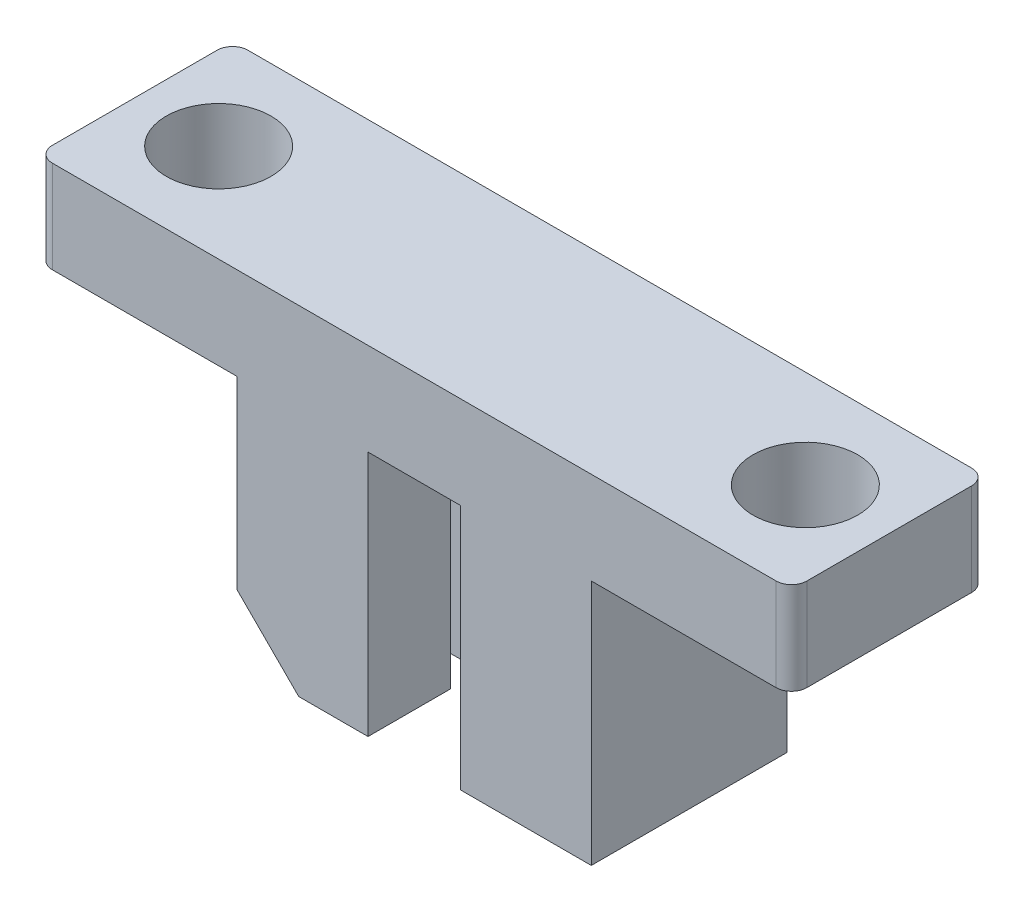
ISO-10303-21;
HEADER;
FILE_DESCRIPTION(('STEP AP214'),'2;1');
FILE_NAME('part.step','',(''),(''),'','','');
FILE_SCHEMA(('AUTOMOTIVE_DESIGN { 1 0 10303 214 1 1 1 1 }'));
ENDSEC;
DATA;
#1=APPLICATION_CONTEXT('core data for automotive mechanical design processes');
#2=APPLICATION_PROTOCOL_DEFINITION('international standard','automotive_design',2000,#1);
#3=PRODUCT_CONTEXT('',#1,'mechanical');
#4=PRODUCT('Part','Part','',(#3));
#5=PRODUCT_RELATED_PRODUCT_CATEGORY('part','',(#4));
#6=PRODUCT_DEFINITION_FORMATION('','',#4);
#7=PRODUCT_DEFINITION_CONTEXT('part definition',#1,'design');
#8=PRODUCT_DEFINITION('design','',#6,#7);
#9=PRODUCT_DEFINITION_SHAPE('','',#8);
#10=(LENGTH_UNIT() NAMED_UNIT(*) SI_UNIT(.MILLI.,.METRE.));
#11=(NAMED_UNIT(*) PLANE_ANGLE_UNIT() SI_UNIT($,.RADIAN.));
#12=(NAMED_UNIT(*) SI_UNIT($,.STERADIAN.) SOLID_ANGLE_UNIT());
#13=UNCERTAINTY_MEASURE_WITH_UNIT(LENGTH_MEASURE(1.E-05),#10,'distance_accuracy_value','');
#14=(GEOMETRIC_REPRESENTATION_CONTEXT(3) GLOBAL_UNCERTAINTY_ASSIGNED_CONTEXT((#13)) GLOBAL_UNIT_ASSIGNED_CONTEXT((#10,
#11,#12)) REPRESENTATION_CONTEXT('',''));
#15=CARTESIAN_POINT('',(0.,0.,0.));
#16=DIRECTION('',(0.,0.,1.));
#17=DIRECTION('',(1.,0.,0.));
#18=AXIS2_PLACEMENT_3D('',#15,#16,#17);
#19=CARTESIAN_POINT('',(-12.25,-3.,3.175));
#20=DIRECTION('',(1.,0.,0.));
#21=DIRECTION('',(0.,0.707106781186548,0.707106781186548));
#22=AXIS2_PLACEMENT_3D('',#19,#20,#21);
#23=PLANE('',#22);
#24=DIRECTION('',(0.,0.,-1.));
#25=VECTOR('',#24,1.);
#26=CARTESIAN_POINT('',(-12.25,-3.,2.675));
#27=LINE('',#26,#25);
#28=CARTESIAN_POINT('',(-12.25,-3.,2.675));
#29=VERTEX_POINT('',#28);
#30=CARTESIAN_POINT('',(-12.25,-3.,-2.675));
#31=VERTEX_POINT('',#30);
#32=EDGE_CURVE('E35',#29,#31,#27,.T.);
#33=ORIENTED_EDGE('',*,*,#32,.F.);
#34=DIRECTION('',(0.,1.,0.));
#35=VECTOR('',#34,1.);
#36=CARTESIAN_POINT('',(-12.25,0.,2.675));
#37=LINE('',#36,#35);
#38=CARTESIAN_POINT('',(-12.25,0.,2.675));
#39=VERTEX_POINT('',#38);
#40=EDGE_CURVE('E11',#29,#39,#37,.T.);
#41=ORIENTED_EDGE('',*,*,#40,.T.);
#42=DIRECTION('',(0.,0.,-1.));
#43=VECTOR('',#42,1.);
#44=CARTESIAN_POINT('',(-12.25,0.,2.675));
#45=LINE('',#44,#43);
#46=CARTESIAN_POINT('',(-12.25,0.,-2.675));
#47=VERTEX_POINT('',#46);
#48=EDGE_CURVE('E27',#39,#47,#45,.T.);
#49=ORIENTED_EDGE('',*,*,#48,.T.);
#50=DIRECTION('',(0.,-1.,0.));
#51=VECTOR('',#50,1.);
#52=CARTESIAN_POINT('',(-12.25,0.,-2.675));
#53=LINE('',#52,#51);
#54=EDGE_CURVE('E410',#47,#31,#53,.T.);
#55=ORIENTED_EDGE('',*,*,#54,.T.);
#56=EDGE_LOOP('',(#33,#41,#49,#55));
#57=FACE_BOUND('',#56,.T.);
#58=ADVANCED_FACE('F17',(#57),#23,.F.);
#59=CARTESIAN_POINT('',(-5.75,-3.,3.175));
#60=DIRECTION('',(0.,1.,0.));
#61=DIRECTION('',(0.707106781186548,0.,0.707106781186548));
#62=AXIS2_PLACEMENT_3D('',#59,#60,#61);
#63=PLANE('',#62);
#64=DIRECTION('',(1.,0.,0.));
#65=VECTOR('',#64,1.);
#66=CARTESIAN_POINT('',(-11.75,-3.,3.175));
#67=LINE('',#66,#65);
#68=CARTESIAN_POINT('',(-11.75,-3.,3.175));
#69=VERTEX_POINT('',#68);
#70=CARTESIAN_POINT('',(-5.75,-3.,3.175));
#71=VERTEX_POINT('',#70);
#72=EDGE_CURVE('E346',#69,#71,#67,.T.);
#73=ORIENTED_EDGE('',*,*,#72,.F.);
#74=CARTESIAN_POINT('',(-11.75,-3.,2.675));
#75=DIRECTION('',(0.,-1.,0.));
#76=DIRECTION('',(-1.,0.,0.));
#77=AXIS2_PLACEMENT_3D('',#74,#75,#76);
#78=CIRCLE('',#77,0.5);
#79=EDGE_CURVE('E407',#69,#29,#78,.T.);
#80=ORIENTED_EDGE('',*,*,#79,.T.);
#81=ORIENTED_EDGE('',*,*,#32,.T.);
#82=CARTESIAN_POINT('',(-11.75,-3.,-2.675));
#83=DIRECTION('',(0.,-1.,0.));
#84=DIRECTION('',(-1.,0.,0.));
#85=AXIS2_PLACEMENT_3D('',#82,#83,#84);
#86=CIRCLE('',#85,0.5);
#87=CARTESIAN_POINT('',(-11.75,-3.,-3.175));
#88=VERTEX_POINT('',#87);
#89=EDGE_CURVE('E404',#31,#88,#86,.T.);
#90=ORIENTED_EDGE('',*,*,#89,.T.);
#91=DIRECTION('',(1.,0.,0.));
#92=VECTOR('',#91,1.);
#93=CARTESIAN_POINT('',(-11.75,-3.,-3.175));
#94=LINE('',#93,#92);
#95=CARTESIAN_POINT('',(-5.75,-3.,-3.175));
#96=VERTEX_POINT('',#95);
#97=EDGE_CURVE('E398',#88,#96,#94,.T.);
#98=ORIENTED_EDGE('',*,*,#97,.T.);
#99=DIRECTION('',(0.,0.,-1.));
#100=VECTOR('',#99,1.);
#101=CARTESIAN_POINT('',(-5.75,-3.,3.175));
#102=LINE('',#101,#100);
#103=EDGE_CURVE('E392',#71,#96,#102,.T.);
#104=ORIENTED_EDGE('',*,*,#103,.F.);
#105=EDGE_LOOP('',(#73,#80,#81,#90,#98,#104));
#106=FACE_BOUND('',#105,.T.);
#107=CARTESIAN_POINT('',(-9.525,-3.,0.));
#108=DIRECTION('',(0.,-1.,0.));
#109=DIRECTION('',(0.,0.,-1.));
#110=AXIS2_PLACEMENT_3D('',#107,#108,#109);
#111=CIRCLE('',#110,1.7);
#112=CARTESIAN_POINT('',(-9.525,-3.,-1.7));
#113=VERTEX_POINT('',#112);
#114=EDGE_CURVE('E313',#113,#113,#111,.T.);
#115=ORIENTED_EDGE('',*,*,#114,.F.);
#116=EDGE_LOOP('',(#115));
#117=FACE_BOUND('',#116,.T.);
#118=ADVANCED_FACE('F416',(#106,#117),#63,.F.);
#119=CARTESIAN_POINT('',(-5.75,-9.,3.175));
#120=DIRECTION('',(1.,0.,0.));
#121=DIRECTION('',(0.,0.707106781186548,0.707106781186548));
#122=AXIS2_PLACEMENT_3D('',#119,#120,#121);
#123=PLANE('',#122);
#124=DIRECTION('',(0.,-1.,0.));
#125=VECTOR('',#124,1.);
#126=CARTESIAN_POINT('',(-5.75,-3.,-3.175));
#127=LINE('',#126,#125);
#128=CARTESIAN_POINT('',(-5.75,-9.,-3.175));
#129=VERTEX_POINT('',#128);
#130=EDGE_CURVE('E395',#96,#129,#127,.T.);
#131=ORIENTED_EDGE('',*,*,#130,.T.);
#132=DIRECTION('',(0.,0.,-1.));
#133=VECTOR('',#132,1.);
#134=CARTESIAN_POINT('',(-5.75,-9.,3.175));
#135=LINE('',#134,#133);
#136=CARTESIAN_POINT('',(-5.75,-9.,3.175));
#137=VERTEX_POINT('',#136);
#138=EDGE_CURVE('E389',#137,#129,#135,.T.);
#139=ORIENTED_EDGE('',*,*,#138,.F.);
#140=DIRECTION('',(0.,-1.,0.));
#141=VECTOR('',#140,1.);
#142=CARTESIAN_POINT('',(-5.75,-3.,3.175));
#143=LINE('',#142,#141);
#144=EDGE_CURVE('E382',#71,#137,#143,.T.);
#145=ORIENTED_EDGE('',*,*,#144,.F.);
#146=ORIENTED_EDGE('',*,*,#103,.T.);
#147=EDGE_LOOP('',(#131,#139,#145,#146));
#148=FACE_BOUND('',#147,.T.);
#149=ADVANCED_FACE('F430',(#148),#123,.F.);
#150=CARTESIAN_POINT('',(-3.75,-11.,3.175));
#151=DIRECTION('',(0.707106781186548,0.707106781186548,0.));
#152=DIRECTION('',(-0.577350269189626,0.577350269189626,0.577350269189626));
#153=AXIS2_PLACEMENT_3D('',#150,#151,#152);
#154=PLANE('',#153);
#155=DIRECTION('',(0.707106781186548,-0.707106781186548,0.));
#156=VECTOR('',#155,1.);
#157=CARTESIAN_POINT('',(-5.75,-9.,-3.175));
#158=LINE('',#157,#156);
#159=CARTESIAN_POINT('',(-3.75,-11.,-3.175));
#160=VERTEX_POINT('',#159);
#161=EDGE_CURVE('E390',#129,#160,#158,.T.);
#162=ORIENTED_EDGE('',*,*,#161,.T.);
#163=DIRECTION('',(0.,0.,-1.));
#164=VECTOR('',#163,1.);
#165=CARTESIAN_POINT('',(-3.75,-11.,3.175));
#166=LINE('',#165,#164);
#167=CARTESIAN_POINT('',(-3.75,-11.,3.175));
#168=VERTEX_POINT('',#167);
#169=EDGE_CURVE('E378',#168,#160,#166,.T.);
#170=ORIENTED_EDGE('',*,*,#169,.F.);
#171=DIRECTION('',(0.707106781186548,-0.707106781186548,0.));
#172=VECTOR('',#171,1.);
#173=CARTESIAN_POINT('',(-5.75,-9.,3.175));
#174=LINE('',#173,#172);
#175=EDGE_CURVE('E380',#137,#168,#174,.T.);
#176=ORIENTED_EDGE('',*,*,#175,.F.);
#177=ORIENTED_EDGE('',*,*,#138,.T.);
#178=EDGE_LOOP('',(#162,#170,#176,#177));
#179=FACE_BOUND('',#178,.T.);
#180=ADVANCED_FACE('F474',(#179),#154,.F.);
#181=CARTESIAN_POINT('',(-1.5,-11.,3.175));
#182=DIRECTION('',(0.,1.,0.));
#183=DIRECTION('',(0.707106781186548,0.,0.707106781186548));
#184=AXIS2_PLACEMENT_3D('',#181,#182,#183);
#185=PLANE('',#184);
#186=DIRECTION('',(0.,0.,-1.));
#187=VECTOR('',#186,1.);
#188=CARTESIAN_POINT('',(-2.675,-11.,0.5));
#189=LINE('',#188,#187);
#190=CARTESIAN_POINT('',(-2.675,-11.,0.5));
#191=VERTEX_POINT('',#190);
#192=CARTESIAN_POINT('',(-2.675,-11.,-0.5));
#193=VERTEX_POINT('',#192);
#194=EDGE_CURVE('E214',#191,#193,#189,.T.);
#195=ORIENTED_EDGE('',*,*,#194,.F.);
#196=DIRECTION('',(-1.,0.,0.));
#197=VECTOR('',#196,1.);
#198=CARTESIAN_POINT('',(-1.5,-11.,0.5));
#199=LINE('',#198,#197);
#200=CARTESIAN_POINT('',(-1.5,-11.,0.5));
#201=VERTEX_POINT('',#200);
#202=EDGE_CURVE('E206',#201,#191,#199,.T.);
#203=ORIENTED_EDGE('',*,*,#202,.F.);
#204=DIRECTION('',(0.,0.,-1.));
#205=VECTOR('',#204,1.);
#206=CARTESIAN_POINT('',(-1.5,-11.,3.175));
#207=LINE('',#206,#205);
#208=CARTESIAN_POINT('',(-1.5,-11.,3.175));
#209=VERTEX_POINT('',#208);
#210=EDGE_CURVE('E230',#209,#201,#207,.T.);
#211=ORIENTED_EDGE('',*,*,#210,.F.);
#212=DIRECTION('',(1.,0.,0.));
#213=VECTOR('',#212,1.);
#214=CARTESIAN_POINT('',(-3.75,-11.,3.175));
#215=LINE('',#214,#213);
#216=EDGE_CURVE('E244',#168,#209,#215,.T.);
#217=ORIENTED_EDGE('',*,*,#216,.F.);
#218=ORIENTED_EDGE('',*,*,#169,.T.);
#219=DIRECTION('',(1.,0.,0.));
#220=VECTOR('',#219,1.);
#221=CARTESIAN_POINT('',(-3.75,-11.,-3.175));
#222=LINE('',#221,#220);
#223=CARTESIAN_POINT('',(-1.5,-11.,-3.175));
#224=VERTEX_POINT('',#223);
#225=EDGE_CURVE('E375',#160,#224,#222,.T.);
#226=ORIENTED_EDGE('',*,*,#225,.T.);
#227=DIRECTION('',(0.,0.,-1.));
#228=VECTOR('',#227,1.);
#229=CARTESIAN_POINT('',(-1.5,-11.,-0.5));
#230=LINE('',#229,#228);
#231=CARTESIAN_POINT('',(-1.5,-11.,-0.5));
#232=VERTEX_POINT('',#231);
#233=EDGE_CURVE('E225',#232,#224,#230,.T.);
#234=ORIENTED_EDGE('',*,*,#233,.F.);
#235=DIRECTION('',(1.,0.,0.));
#236=VECTOR('',#235,1.);
#237=CARTESIAN_POINT('',(-2.675,-11.,-0.5));
#238=LINE('',#237,#236);
#239=EDGE_CURVE('E216',#193,#232,#238,.T.);
#240=ORIENTED_EDGE('',*,*,#239,.F.);
#241=EDGE_LOOP('',(#195,#203,#211,#217,#218,#226,#234,#240));
#242=FACE_BOUND('',#241,.T.);
#243=ADVANCED_FACE('F369',(#242),#185,.F.);
#244=CARTESIAN_POINT('',(-1.5,-3.,3.175));
#245=DIRECTION('',(-1.,0.,0.));
#246=DIRECTION('',(0.,0.707106781186548,0.707106781186548));
#247=AXIS2_PLACEMENT_3D('',#244,#245,#246);
#248=PLANE('',#247);
#249=ORIENTED_EDGE('',*,*,#210,.T.);
#250=DIRECTION('',(0.,1.,0.));
#251=VECTOR('',#250,1.);
#252=CARTESIAN_POINT('',(-1.5,-11.,0.5));
#253=LINE('',#252,#251);
#254=CARTESIAN_POINT('',(-1.5,-5.5,0.5));
#255=VERTEX_POINT('',#254);
#256=EDGE_CURVE('E227',#201,#255,#253,.T.);
#257=ORIENTED_EDGE('',*,*,#256,.T.);
#258=DIRECTION('',(0.,0.,1.));
#259=VECTOR('',#258,1.);
#260=CARTESIAN_POINT('',(-1.5,-5.5,-0.5));
#261=LINE('',#260,#259);
#262=CARTESIAN_POINT('',(-1.5,-5.5,-0.5));
#263=VERTEX_POINT('',#262);
#264=EDGE_CURVE('E231',#263,#255,#261,.T.);
#265=ORIENTED_EDGE('',*,*,#264,.F.);
#266=DIRECTION('',(0.,-1.,0.));
#267=VECTOR('',#266,1.);
#268=CARTESIAN_POINT('',(-1.5,-5.5,-0.5));
#269=LINE('',#268,#267);
#270=EDGE_CURVE('E204',#263,#232,#269,.T.);
#271=ORIENTED_EDGE('',*,*,#270,.T.);
#272=ORIENTED_EDGE('',*,*,#233,.T.);
#273=DIRECTION('',(0.,1.,0.));
#274=VECTOR('',#273,1.);
#275=CARTESIAN_POINT('',(-1.5,-11.,-3.175));
#276=LINE('',#275,#274);
#277=CARTESIAN_POINT('',(-1.5,-3.,-3.175));
#278=VERTEX_POINT('',#277);
#279=EDGE_CURVE('E235',#224,#278,#276,.T.);
#280=ORIENTED_EDGE('',*,*,#279,.T.);
#281=DIRECTION('',(0.,0.,-1.));
#282=VECTOR('',#281,1.);
#283=CARTESIAN_POINT('',(-1.5,-3.,3.175));
#284=LINE('',#283,#282);
#285=CARTESIAN_POINT('',(-1.5,-3.,3.175));
#286=VERTEX_POINT('',#285);
#287=EDGE_CURVE('E239',#286,#278,#284,.T.);
#288=ORIENTED_EDGE('',*,*,#287,.F.);
#289=DIRECTION('',(0.,1.,0.));
#290=VECTOR('',#289,1.);
#291=CARTESIAN_POINT('',(-1.5,-11.,3.175));
#292=LINE('',#291,#290);
#293=EDGE_CURVE('E242',#209,#286,#292,.T.);
#294=ORIENTED_EDGE('',*,*,#293,.F.);
#295=EDGE_LOOP('',(#249,#257,#265,#271,#272,#280,#288,#294));
#296=FACE_BOUND('',#295,.T.);
#297=ADVANCED_FACE('F373',(#296),#248,.F.);
#298=CARTESIAN_POINT('',(1.5,-3.,3.175));
#299=DIRECTION('',(0.,1.,0.));
#300=DIRECTION('',(0.707106781186548,0.,0.707106781186548));
#301=AXIS2_PLACEMENT_3D('',#298,#299,#300);
#302=PLANE('',#301);
#303=DIRECTION('',(1.,0.,0.));
#304=VECTOR('',#303,1.);
#305=CARTESIAN_POINT('',(-1.5,-3.,-3.175));
#306=LINE('',#305,#304);
#307=CARTESIAN_POINT('',(1.5,-3.,-3.175));
#308=VERTEX_POINT('',#307);
#309=EDGE_CURVE('E238',#278,#308,#306,.T.);
#310=ORIENTED_EDGE('',*,*,#309,.T.);
#311=DIRECTION('',(0.,0.,-1.));
#312=VECTOR('',#311,1.);
#313=CARTESIAN_POINT('',(1.5,-3.,3.175));
#314=LINE('',#313,#312);
#315=CARTESIAN_POINT('',(1.5,-3.,3.175));
#316=VERTEX_POINT('',#315);
#317=EDGE_CURVE('E248',#316,#308,#314,.T.);
#318=ORIENTED_EDGE('',*,*,#317,.F.);
#319=DIRECTION('',(1.,0.,0.));
#320=VECTOR('',#319,1.);
#321=CARTESIAN_POINT('',(-1.5,-3.,3.175));
#322=LINE('',#321,#320);
#323=EDGE_CURVE('E245',#286,#316,#322,.T.);
#324=ORIENTED_EDGE('',*,*,#323,.F.);
#325=ORIENTED_EDGE('',*,*,#287,.T.);
#326=EDGE_LOOP('',(#310,#318,#324,#325));
#327=FACE_BOUND('',#326,.T.);
#328=ADVANCED_FACE('F471',(#327),#302,.F.);
#329=CARTESIAN_POINT('',(1.5,-11.,3.175));
#330=DIRECTION('',(1.,0.,0.));
#331=DIRECTION('',(0.,0.707106781186548,0.707106781186548));
#332=AXIS2_PLACEMENT_3D('',#329,#330,#331);
#333=PLANE('',#332);
#334=DIRECTION('',(0.,0.,-1.));
#335=VECTOR('',#334,1.);
#336=CARTESIAN_POINT('',(1.5,-5.5,0.5));
#337=LINE('',#336,#335);
#338=CARTESIAN_POINT('',(1.5,-5.5,0.5));
#339=VERTEX_POINT('',#338);
#340=CARTESIAN_POINT('',(1.5,-5.5,-0.5));
#341=VERTEX_POINT('',#340);
#342=EDGE_CURVE('E253',#339,#341,#337,.T.);
#343=ORIENTED_EDGE('',*,*,#342,.F.);
#344=DIRECTION('',(0.,-1.,0.));
#345=VECTOR('',#344,1.);
#346=CARTESIAN_POINT('',(1.5,-5.5,0.5));
#347=LINE('',#346,#345);
#348=CARTESIAN_POINT('',(1.5,-11.,0.5));
#349=VERTEX_POINT('',#348);
#350=EDGE_CURVE('E241',#339,#349,#347,.T.);
#351=ORIENTED_EDGE('',*,*,#350,.T.);
#352=DIRECTION('',(0.,0.,-1.));
#353=VECTOR('',#352,1.);
#354=CARTESIAN_POINT('',(1.5,-11.,3.175));
#355=LINE('',#354,#353);
#356=CARTESIAN_POINT('',(1.5,-11.,3.175));
#357=VERTEX_POINT('',#356);
#358=EDGE_CURVE('E259',#357,#349,#355,.T.);
#359=ORIENTED_EDGE('',*,*,#358,.F.);
#360=DIRECTION('',(0.,-1.,0.));
#361=VECTOR('',#360,1.);
#362=CARTESIAN_POINT('',(1.5,-3.,3.175));
#363=LINE('',#362,#361);
#364=EDGE_CURVE('E252',#316,#357,#363,.T.);
#365=ORIENTED_EDGE('',*,*,#364,.F.);
#366=ORIENTED_EDGE('',*,*,#317,.T.);
#367=DIRECTION('',(0.,-1.,0.));
#368=VECTOR('',#367,1.);
#369=CARTESIAN_POINT('',(1.5,-3.,-3.175));
#370=LINE('',#369,#368);
#371=CARTESIAN_POINT('',(1.5,-11.,-3.175));
#372=VERTEX_POINT('',#371);
#373=EDGE_CURVE('E250',#308,#372,#370,.T.);
#374=ORIENTED_EDGE('',*,*,#373,.T.);
#375=DIRECTION('',(0.,0.,-1.));
#376=VECTOR('',#375,1.);
#377=CARTESIAN_POINT('',(1.5,-11.,-0.5));
#378=LINE('',#377,#376);
#379=CARTESIAN_POINT('',(1.5,-11.,-0.5));
#380=VERTEX_POINT('',#379);
#381=EDGE_CURVE('E267',#380,#372,#378,.T.);
#382=ORIENTED_EDGE('',*,*,#381,.F.);
#383=DIRECTION('',(0.,1.,0.));
#384=VECTOR('',#383,1.);
#385=CARTESIAN_POINT('',(1.5,-11.,-0.5));
#386=LINE('',#385,#384);
#387=EDGE_CURVE('E261',#380,#341,#386,.T.);
#388=ORIENTED_EDGE('',*,*,#387,.T.);
#389=EDGE_LOOP('',(#343,#351,#359,#365,#366,#374,#382,#388));
#390=FACE_BOUND('',#389,.T.);
#391=ADVANCED_FACE('F464',(#390),#333,.F.);
#392=CARTESIAN_POINT('',(5.75,-11.,3.175));
#393=DIRECTION('',(0.,1.,0.));
#394=DIRECTION('',(0.707106781186548,0.,0.707106781186548));
#395=AXIS2_PLACEMENT_3D('',#392,#393,#394);
#396=PLANE('',#395);
#397=ORIENTED_EDGE('',*,*,#358,.T.);
#398=DIRECTION('',(-1.,0.,0.));
#399=VECTOR('',#398,1.);
#400=CARTESIAN_POINT('',(2.675,-11.,0.5));
#401=LINE('',#400,#399);
#402=CARTESIAN_POINT('',(2.675,-11.,0.5));
#403=VERTEX_POINT('',#402);
#404=EDGE_CURVE('E255',#403,#349,#401,.T.);
#405=ORIENTED_EDGE('',*,*,#404,.F.);
#406=DIRECTION('',(0.,0.,1.));
#407=VECTOR('',#406,1.);
#408=CARTESIAN_POINT('',(2.675,-11.,-0.5));
#409=LINE('',#408,#407);
#410=CARTESIAN_POINT('',(2.675,-11.,-0.5));
#411=VERTEX_POINT('',#410);
#412=EDGE_CURVE('E275',#411,#403,#409,.T.);
#413=ORIENTED_EDGE('',*,*,#412,.F.);
#414=DIRECTION('',(-1.,0.,0.));
#415=VECTOR('',#414,1.);
#416=CARTESIAN_POINT('',(2.675,-11.,-0.5));
#417=LINE('',#416,#415);
#418=EDGE_CURVE('E262',#411,#380,#417,.T.);
#419=ORIENTED_EDGE('',*,*,#418,.T.);
#420=ORIENTED_EDGE('',*,*,#381,.T.);
#421=DIRECTION('',(1.,0.,0.));
#422=VECTOR('',#421,1.);
#423=CARTESIAN_POINT('',(1.5,-11.,-3.175));
#424=LINE('',#423,#422);
#425=CARTESIAN_POINT('',(5.75,-11.,-3.175));
#426=VERTEX_POINT('',#425);
#427=EDGE_CURVE('E269',#372,#426,#424,.T.);
#428=ORIENTED_EDGE('',*,*,#427,.T.);
#429=DIRECTION('',(0.,0.,-1.));
#430=VECTOR('',#429,1.);
#431=CARTESIAN_POINT('',(5.75,-11.,3.175));
#432=LINE('',#431,#430);
#433=CARTESIAN_POINT('',(5.75,-11.,3.175));
#434=VERTEX_POINT('',#433);
#435=EDGE_CURVE('E285',#434,#426,#432,.T.);
#436=ORIENTED_EDGE('',*,*,#435,.F.);
#437=DIRECTION('',(1.,0.,0.));
#438=VECTOR('',#437,1.);
#439=CARTESIAN_POINT('',(1.5,-11.,3.175));
#440=LINE('',#439,#438);
#441=EDGE_CURVE('E264',#357,#434,#440,.T.);
#442=ORIENTED_EDGE('',*,*,#441,.F.);
#443=EDGE_LOOP('',(#397,#405,#413,#419,#420,#428,#436,#442));
#444=FACE_BOUND('',#443,.T.);
#445=ADVANCED_FACE('F459',(#444),#396,.F.);
#446=CARTESIAN_POINT('',(5.75,-3.,3.175));
#447=DIRECTION('',(-1.,0.,0.));
#448=DIRECTION('',(0.,0.707106781186548,0.707106781186548));
#449=AXIS2_PLACEMENT_3D('',#446,#447,#448);
#450=PLANE('',#449);
#451=DIRECTION('',(0.,1.,0.));
#452=VECTOR('',#451,1.);
#453=CARTESIAN_POINT('',(5.75,-11.,-3.175));
#454=LINE('',#453,#452);
#455=CARTESIAN_POINT('',(5.75,-3.,-3.175));
#456=VERTEX_POINT('',#455);
#457=EDGE_CURVE('E284',#426,#456,#454,.T.);
#458=ORIENTED_EDGE('',*,*,#457,.T.);
#459=DIRECTION('',(0.,0.,-1.));
#460=VECTOR('',#459,1.);
#461=CARTESIAN_POINT('',(5.75,-3.,3.175));
#462=LINE('',#461,#460);
#463=CARTESIAN_POINT('',(5.75,-3.,3.175));
#464=VERTEX_POINT('',#463);
#465=EDGE_CURVE('E292',#464,#456,#462,.T.);
#466=ORIENTED_EDGE('',*,*,#465,.F.);
#467=DIRECTION('',(0.,1.,0.));
#468=VECTOR('',#467,1.);
#469=CARTESIAN_POINT('',(5.75,-11.,3.175));
#470=LINE('',#469,#468);
#471=EDGE_CURVE('E289',#434,#464,#470,.T.);
#472=ORIENTED_EDGE('',*,*,#471,.F.);
#473=ORIENTED_EDGE('',*,*,#435,.T.);
#474=EDGE_LOOP('',(#458,#466,#472,#473));
#475=FACE_BOUND('',#474,.T.);
#476=ADVANCED_FACE('F455',(#475),#450,.F.);
#477=CARTESIAN_POINT('',(12.25,-3.,3.175));
#478=DIRECTION('',(0.,1.,0.));
#479=DIRECTION('',(0.707106781186548,0.,0.707106781186548));
#480=AXIS2_PLACEMENT_3D('',#477,#478,#479);
#481=PLANE('',#480);
#482=DIRECTION('',(0.,0.,-1.));
#483=VECTOR('',#482,1.);
#484=CARTESIAN_POINT('',(12.25,-3.,2.675));
#485=LINE('',#484,#483);
#486=CARTESIAN_POINT('',(12.25,-3.,2.675));
#487=VERTEX_POINT('',#486);
#488=CARTESIAN_POINT('',(12.25,-3.,-2.675));
#489=VERTEX_POINT('',#488);
#490=EDGE_CURVE('E297',#487,#489,#485,.T.);
#491=ORIENTED_EDGE('',*,*,#490,.F.);
#492=CARTESIAN_POINT('',(11.75,-3.,2.675));
#493=DIRECTION('',(0.,-1.,0.));
#494=DIRECTION('',(-1.,0.,0.));
#495=AXIS2_PLACEMENT_3D('',#492,#493,#494);
#496=CIRCLE('',#495,0.5);
#497=CARTESIAN_POINT('',(11.75,-3.,3.175));
#498=VERTEX_POINT('',#497);
#499=EDGE_CURVE('E287',#487,#498,#496,.T.);
#500=ORIENTED_EDGE('',*,*,#499,.T.);
#501=DIRECTION('',(1.,0.,0.));
#502=VECTOR('',#501,1.);
#503=CARTESIAN_POINT('',(5.75,-3.,3.175));
#504=LINE('',#503,#502);
#505=EDGE_CURVE('E296',#464,#498,#504,.T.);
#506=ORIENTED_EDGE('',*,*,#505,.F.);
#507=ORIENTED_EDGE('',*,*,#465,.T.);
#508=DIRECTION('',(1.,0.,0.));
#509=VECTOR('',#508,1.);
#510=CARTESIAN_POINT('',(5.75,-3.,-3.175));
#511=LINE('',#510,#509);
#512=CARTESIAN_POINT('',(11.75,-3.,-3.175));
#513=VERTEX_POINT('',#512);
#514=EDGE_CURVE('E294',#456,#513,#511,.T.);
#515=ORIENTED_EDGE('',*,*,#514,.T.);
#516=CARTESIAN_POINT('',(11.75,-3.,-2.675));
#517=DIRECTION('',(0.,-1.,0.));
#518=DIRECTION('',(-1.,0.,0.));
#519=AXIS2_PLACEMENT_3D('',#516,#517,#518);
#520=CIRCLE('',#519,0.5);
#521=EDGE_CURVE('E307',#513,#489,#520,.T.);
#522=ORIENTED_EDGE('',*,*,#521,.T.);
#523=EDGE_LOOP('',(#491,#500,#506,#507,#515,#522));
#524=FACE_BOUND('',#523,.T.);
#525=CARTESIAN_POINT('',(9.525,-3.,0.));
#526=DIRECTION('',(0.,-1.,0.));
#527=DIRECTION('',(0.,0.,-1.));
#528=AXIS2_PLACEMENT_3D('',#525,#526,#527);
#529=CIRCLE('',#528,1.7);
#530=CARTESIAN_POINT('',(9.525,-3.,-1.7));
#531=VERTEX_POINT('',#530);
#532=EDGE_CURVE('E310',#531,#531,#529,.T.);
#533=ORIENTED_EDGE('',*,*,#532,.F.);
#534=EDGE_LOOP('',(#533));
#535=FACE_BOUND('',#534,.T.);
#536=ADVANCED_FACE('F449',(#524,#535),#481,.F.);
#537=CARTESIAN_POINT('',(12.25,0.,3.175));
#538=DIRECTION('',(-1.,0.,0.));
#539=DIRECTION('',(0.,0.707106781186548,0.707106781186548));
#540=AXIS2_PLACEMENT_3D('',#537,#538,#539);
#541=PLANE('',#540);
#542=DIRECTION('',(0.,0.,-1.));
#543=VECTOR('',#542,1.);
#544=CARTESIAN_POINT('',(12.25,0.,2.675));
#545=LINE('',#544,#543);
#546=CARTESIAN_POINT('',(12.25,0.,2.675));
#547=VERTEX_POINT('',#546);
#548=CARTESIAN_POINT('',(12.25,0.,-2.675));
#549=VERTEX_POINT('',#548);
#550=EDGE_CURVE('E314',#547,#549,#545,.T.);
#551=ORIENTED_EDGE('',*,*,#550,.F.);
#552=DIRECTION('',(0.,-1.,0.));
#553=VECTOR('',#552,1.);
#554=CARTESIAN_POINT('',(12.25,-3.,2.675));
#555=LINE('',#554,#553);
#556=EDGE_CURVE('E299',#547,#487,#555,.T.);
#557=ORIENTED_EDGE('',*,*,#556,.T.);
#558=ORIENTED_EDGE('',*,*,#490,.T.);
#559=DIRECTION('',(0.,1.,0.));
#560=VECTOR('',#559,1.);
#561=CARTESIAN_POINT('',(12.25,-3.,-2.675));
#562=LINE('',#561,#560);
#563=EDGE_CURVE('E300',#489,#549,#562,.T.);
#564=ORIENTED_EDGE('',*,*,#563,.T.);
#565=EDGE_LOOP('',(#551,#557,#558,#564));
#566=FACE_BOUND('',#565,.T.);
#567=ADVANCED_FACE('F571',(#566),#541,.F.);
#568=CARTESIAN_POINT('',(-12.25,0.,3.175));
#569=DIRECTION('',(0.,-1.,0.));
#570=DIRECTION('',(0.707106781186548,0.,0.707106781186548));
#571=AXIS2_PLACEMENT_3D('',#568,#569,#570);
#572=PLANE('',#571);
#573=ORIENTED_EDGE('',*,*,#48,.F.);
#574=CARTESIAN_POINT('',(-11.75,0.,2.675));
#575=DIRECTION('',(0.,1.,0.));
#576=DIRECTION('',(1.,0.,0.));
#577=AXIS2_PLACEMENT_3D('',#574,#575,#576);
#578=CIRCLE('',#577,0.5);
#579=CARTESIAN_POINT('',(-11.75,0.,3.175));
#580=VERTEX_POINT('',#579);
#581=EDGE_CURVE('E322',#39,#580,#578,.T.);
#582=ORIENTED_EDGE('',*,*,#581,.T.);
#583=DIRECTION('',(-1.,0.,0.));
#584=VECTOR('',#583,1.);
#585=CARTESIAN_POINT('',(11.75,0.,3.175));
#586=LINE('',#585,#584);
#587=CARTESIAN_POINT('',(11.75,0.,3.175));
#588=VERTEX_POINT('',#587);
#589=EDGE_CURVE('E325',#588,#580,#586,.T.);
#590=ORIENTED_EDGE('',*,*,#589,.F.);
#591=CARTESIAN_POINT('',(11.75,0.,2.675));
#592=DIRECTION('',(0.,1.,0.));
#593=DIRECTION('',(1.,0.,0.));
#594=AXIS2_PLACEMENT_3D('',#591,#592,#593);
#595=CIRCLE('',#594,0.5);
#596=EDGE_CURVE('E316',#588,#547,#595,.T.);
#597=ORIENTED_EDGE('',*,*,#596,.T.);
#598=ORIENTED_EDGE('',*,*,#550,.T.);
#599=CARTESIAN_POINT('',(11.75,0.,-2.675));
#600=DIRECTION('',(0.,1.,0.));
#601=DIRECTION('',(1.,0.,0.));
#602=AXIS2_PLACEMENT_3D('',#599,#600,#601);
#603=CIRCLE('',#602,0.5);
#604=CARTESIAN_POINT('',(11.75,0.,-3.175));
#605=VERTEX_POINT('',#604);
#606=EDGE_CURVE('E317',#549,#605,#603,.T.);
#607=ORIENTED_EDGE('',*,*,#606,.T.);
#608=DIRECTION('',(-1.,0.,0.));
#609=VECTOR('',#608,1.);
#610=CARTESIAN_POINT('',(11.75,0.,-3.175));
#611=LINE('',#610,#609);
#612=CARTESIAN_POINT('',(-11.75,0.,-3.175));
#613=VERTEX_POINT('',#612);
#614=EDGE_CURVE('E333',#605,#613,#611,.T.);
#615=ORIENTED_EDGE('',*,*,#614,.T.);
#616=CARTESIAN_POINT('',(-11.75,0.,-2.675));
#617=DIRECTION('',(0.,1.,0.));
#618=DIRECTION('',(1.,0.,0.));
#619=AXIS2_PLACEMENT_3D('',#616,#617,#618);
#620=CIRCLE('',#619,0.5);
#621=EDGE_CURVE('E336',#613,#47,#620,.T.);
#622=ORIENTED_EDGE('',*,*,#621,.T.);
#623=EDGE_LOOP('',(#573,#582,#590,#597,#598,#607,#615,#622));
#624=FACE_BOUND('',#623,.T.);
#625=CARTESIAN_POINT('',(-9.525,0.,0.));
#626=DIRECTION('',(0.,-1.,0.));
#627=DIRECTION('',(0.,0.,-1.));
#628=AXIS2_PLACEMENT_3D('',#625,#626,#627);
#629=CIRCLE('',#628,1.7);
#630=CARTESIAN_POINT('',(-9.525,0.,-1.7));
#631=VERTEX_POINT('',#630);
#632=EDGE_CURVE('E339',#631,#631,#629,.T.);
#633=ORIENTED_EDGE('',*,*,#632,.T.);
#634=EDGE_LOOP('',(#633));
#635=FACE_BOUND('',#634,.T.);
#636=CARTESIAN_POINT('',(9.525,0.,0.));
#637=DIRECTION('',(0.,-1.,0.));
#638=DIRECTION('',(0.,0.,-1.));
#639=AXIS2_PLACEMENT_3D('',#636,#637,#638);
#640=CIRCLE('',#639,1.7);
#641=CARTESIAN_POINT('',(9.525,0.,-1.7));
#642=VERTEX_POINT('',#641);
#643=EDGE_CURVE('E327',#642,#642,#640,.T.);
#644=ORIENTED_EDGE('',*,*,#643,.T.);
#645=EDGE_LOOP('',(#644));
#646=FACE_BOUND('',#645,.T.);
#647=ADVANCED_FACE('F437',(#624,#635,#646),#572,.F.);
#648=CARTESIAN_POINT('',(0.,0.,3.175));
#649=DIRECTION('',(0.,0.,-1.));
#650=DIRECTION('',(0.707106781186548,0.707106781186548,0.));
#651=AXIS2_PLACEMENT_3D('',#648,#649,#650);
#652=PLANE('',#651);
#653=ORIENTED_EDGE('',*,*,#589,.T.);
#654=DIRECTION('',(0.,-1.,0.));
#655=VECTOR('',#654,1.);
#656=CARTESIAN_POINT('',(-11.75,0.,3.175));
#657=LINE('',#656,#655);
#658=EDGE_CURVE('E328',#580,#69,#657,.T.);
#659=ORIENTED_EDGE('',*,*,#658,.T.);
#660=ORIENTED_EDGE('',*,*,#72,.T.);
#661=ORIENTED_EDGE('',*,*,#144,.T.);
#662=ORIENTED_EDGE('',*,*,#175,.T.);
#663=ORIENTED_EDGE('',*,*,#216,.T.);
#664=ORIENTED_EDGE('',*,*,#293,.T.);
#665=ORIENTED_EDGE('',*,*,#323,.T.);
#666=ORIENTED_EDGE('',*,*,#364,.T.);
#667=ORIENTED_EDGE('',*,*,#441,.T.);
#668=ORIENTED_EDGE('',*,*,#471,.T.);
#669=ORIENTED_EDGE('',*,*,#505,.T.);
#670=DIRECTION('',(0.,1.,0.));
#671=VECTOR('',#670,1.);
#672=CARTESIAN_POINT('',(11.75,-3.,3.175));
#673=LINE('',#672,#671);
#674=EDGE_CURVE('E304',#498,#588,#673,.T.);
#675=ORIENTED_EDGE('',*,*,#674,.T.);
#676=EDGE_LOOP('',(#653,#659,#660,#661,#662,#663,#664,#665,#666,#667,#668,#669,#675));
#677=FACE_BOUND('',#676,.T.);
#678=ADVANCED_FACE('F431',(#677),#652,.F.);
#679=CARTESIAN_POINT('',(0.,0.,-3.175));
#680=DIRECTION('',(0.,0.,-1.));
#681=DIRECTION('',(0.707106781186548,0.707106781186548,0.));
#682=AXIS2_PLACEMENT_3D('',#679,#680,#681);
#683=PLANE('',#682);
#684=ORIENTED_EDGE('',*,*,#614,.F.);
#685=DIRECTION('',(0.,-1.,0.));
#686=VECTOR('',#685,1.);
#687=CARTESIAN_POINT('',(11.75,-3.,-3.175));
#688=LINE('',#687,#686);
#689=EDGE_CURVE('E349',#605,#513,#688,.T.);
#690=ORIENTED_EDGE('',*,*,#689,.T.);
#691=ORIENTED_EDGE('',*,*,#514,.F.);
#692=ORIENTED_EDGE('',*,*,#457,.F.);
#693=ORIENTED_EDGE('',*,*,#427,.F.);
#694=ORIENTED_EDGE('',*,*,#373,.F.);
#695=ORIENTED_EDGE('',*,*,#309,.F.);
#696=ORIENTED_EDGE('',*,*,#279,.F.);
#697=ORIENTED_EDGE('',*,*,#225,.F.);
#698=ORIENTED_EDGE('',*,*,#161,.F.);
#699=ORIENTED_EDGE('',*,*,#130,.F.);
#700=ORIENTED_EDGE('',*,*,#97,.F.);
#701=DIRECTION('',(0.,1.,0.));
#702=VECTOR('',#701,1.);
#703=CARTESIAN_POINT('',(-11.75,0.,-3.175));
#704=LINE('',#703,#702);
#705=EDGE_CURVE('E278',#88,#613,#704,.T.);
#706=ORIENTED_EDGE('',*,*,#705,.T.);
#707=EDGE_LOOP('',(#684,#690,#691,#692,#693,#694,#695,#696,#697,#698,#699,#700,#706));
#708=FACE_BOUND('',#707,.T.);
#709=ADVANCED_FACE('F423',(#708),#683,.T.);
#710=CARTESIAN_POINT('',(2.675,-5.5,-0.5));
#711=DIRECTION('',(0.,0.,-1.));
#712=DIRECTION('',(0.707106781186548,0.707106781186548,0.));
#713=AXIS2_PLACEMENT_3D('',#710,#711,#712);
#714=PLANE('',#713);
#715=ORIENTED_EDGE('',*,*,#418,.F.);
#716=DIRECTION('',(0.,-1.,0.));
#717=VECTOR('',#716,1.);
#718=CARTESIAN_POINT('',(2.675,-5.5,-0.5));
#719=LINE('',#718,#717);
#720=CARTESIAN_POINT('',(2.675,-5.5,-0.5));
#721=VERTEX_POINT('',#720);
#722=EDGE_CURVE('E279',#721,#411,#719,.T.);
#723=ORIENTED_EDGE('',*,*,#722,.F.);
#724=DIRECTION('',(1.,0.,0.));
#725=VECTOR('',#724,1.);
#726=CARTESIAN_POINT('',(1.5,-5.5,-0.5));
#727=LINE('',#726,#725);
#728=EDGE_CURVE('E256',#341,#721,#727,.T.);
#729=ORIENTED_EDGE('',*,*,#728,.F.);
#730=ORIENTED_EDGE('',*,*,#387,.F.);
#731=EDGE_LOOP('',(#715,#723,#729,#730));
#732=FACE_BOUND('',#731,.T.);
#733=ADVANCED_FACE('F609',(#732),#714,.F.);
#734=CARTESIAN_POINT('',(2.675,-5.5,-0.5));
#735=DIRECTION('',(1.,0.,0.));
#736=DIRECTION('',(0.,0.707106781186548,0.707106781186548));
#737=AXIS2_PLACEMENT_3D('',#734,#735,#736);
#738=PLANE('',#737);
#739=ORIENTED_EDGE('',*,*,#412,.T.);
#740=DIRECTION('',(0.,-1.,0.));
#741=VECTOR('',#740,1.);
#742=CARTESIAN_POINT('',(2.675,-5.5,0.5));
#743=LINE('',#742,#741);
#744=CARTESIAN_POINT('',(2.675,-5.5,0.5));
#745=VERTEX_POINT('',#744);
#746=EDGE_CURVE('E274',#745,#403,#743,.T.);
#747=ORIENTED_EDGE('',*,*,#746,.F.);
#748=DIRECTION('',(0.,0.,1.));
#749=VECTOR('',#748,1.);
#750=CARTESIAN_POINT('',(2.675,-5.5,-0.5));
#751=LINE('',#750,#749);
#752=EDGE_CURVE('E357',#721,#745,#751,.T.);
#753=ORIENTED_EDGE('',*,*,#752,.F.);
#754=ORIENTED_EDGE('',*,*,#722,.T.);
#755=EDGE_LOOP('',(#739,#747,#753,#754));
#756=FACE_BOUND('',#755,.T.);
#757=ADVANCED_FACE('F619',(#756),#738,.F.);
#758=CARTESIAN_POINT('',(2.675,-5.5,0.5));
#759=DIRECTION('',(0.,0.,1.));
#760=DIRECTION('',(0.707106781186548,0.707106781186548,0.));
#761=AXIS2_PLACEMENT_3D('',#758,#759,#760);
#762=PLANE('',#761);
#763=DIRECTION('',(-1.,0.,0.));
#764=VECTOR('',#763,1.);
#765=CARTESIAN_POINT('',(2.675,-5.5,0.5));
#766=LINE('',#765,#764);
#767=EDGE_CURVE('E233',#745,#339,#766,.T.);
#768=ORIENTED_EDGE('',*,*,#767,.F.);
#769=ORIENTED_EDGE('',*,*,#746,.T.);
#770=ORIENTED_EDGE('',*,*,#404,.T.);
#771=ORIENTED_EDGE('',*,*,#350,.F.);
#772=EDGE_LOOP('',(#768,#769,#770,#771));
#773=FACE_BOUND('',#772,.T.);
#774=ADVANCED_FACE('F630',(#773),#762,.F.);
#775=CARTESIAN_POINT('',(0.,-5.5,0.));
#776=DIRECTION('',(0.,-1.,0.));
#777=DIRECTION('',(0.707106781186548,0.,0.707106781186548));
#778=AXIS2_PLACEMENT_3D('',#775,#776,#777);
#779=PLANE('',#778);
#780=ORIENTED_EDGE('',*,*,#342,.T.);
#781=ORIENTED_EDGE('',*,*,#728,.T.);
#782=ORIENTED_EDGE('',*,*,#752,.T.);
#783=ORIENTED_EDGE('',*,*,#767,.T.);
#784=EDGE_LOOP('',(#780,#781,#782,#783));
#785=FACE_BOUND('',#784,.T.);
#786=ADVANCED_FACE('F641',(#785),#779,.T.);
#787=CARTESIAN_POINT('',(0.,-5.5,0.));
#788=DIRECTION('',(0.,-1.,0.));
#789=DIRECTION('',(0.707106781186548,0.,0.707106781186548));
#790=AXIS2_PLACEMENT_3D('',#787,#788,#789);
#791=PLANE('',#790);
#792=ORIENTED_EDGE('',*,*,#264,.T.);
#793=DIRECTION('',(-1.,0.,0.));
#794=VECTOR('',#793,1.);
#795=CARTESIAN_POINT('',(-1.5,-5.5,0.5));
#796=LINE('',#795,#794);
#797=CARTESIAN_POINT('',(-2.675,-5.5,0.5));
#798=VERTEX_POINT('',#797);
#799=EDGE_CURVE('E210',#255,#798,#796,.T.);
#800=ORIENTED_EDGE('',*,*,#799,.T.);
#801=DIRECTION('',(0.,0.,-1.));
#802=VECTOR('',#801,1.);
#803=CARTESIAN_POINT('',(-2.675,-5.5,0.5));
#804=LINE('',#803,#802);
#805=CARTESIAN_POINT('',(-2.675,-5.5,-0.5));
#806=VERTEX_POINT('',#805);
#807=EDGE_CURVE('E194',#798,#806,#804,.T.);
#808=ORIENTED_EDGE('',*,*,#807,.T.);
#809=DIRECTION('',(1.,0.,0.));
#810=VECTOR('',#809,1.);
#811=CARTESIAN_POINT('',(-2.675,-5.5,-0.5));
#812=LINE('',#811,#810);
#813=EDGE_CURVE('E201',#806,#263,#812,.T.);
#814=ORIENTED_EDGE('',*,*,#813,.T.);
#815=EDGE_LOOP('',(#792,#800,#808,#814));
#816=FACE_BOUND('',#815,.T.);
#817=ADVANCED_FACE('F208',(#816),#791,.T.);
#818=CARTESIAN_POINT('',(2.675,-5.5,0.5));
#819=DIRECTION('',(0.,0.,1.));
#820=DIRECTION('',(0.707106781186548,0.707106781186548,0.));
#821=AXIS2_PLACEMENT_3D('',#818,#819,#820);
#822=PLANE('',#821);
#823=ORIENTED_EDGE('',*,*,#202,.T.);
#824=DIRECTION('',(0.,-1.,0.));
#825=VECTOR('',#824,1.);
#826=CARTESIAN_POINT('',(-2.675,-5.5,0.5));
#827=LINE('',#826,#825);
#828=EDGE_CURVE('E221',#798,#191,#827,.T.);
#829=ORIENTED_EDGE('',*,*,#828,.F.);
#830=ORIENTED_EDGE('',*,*,#799,.F.);
#831=ORIENTED_EDGE('',*,*,#256,.F.);
#832=EDGE_LOOP('',(#823,#829,#830,#831));
#833=FACE_BOUND('',#832,.T.);
#834=ADVANCED_FACE('F364',(#833),#822,.F.);
#835=CARTESIAN_POINT('',(2.675,-5.5,-0.5));
#836=DIRECTION('',(0.,0.,-1.));
#837=DIRECTION('',(0.707106781186548,0.707106781186548,0.));
#838=AXIS2_PLACEMENT_3D('',#835,#836,#837);
#839=PLANE('',#838);
#840=ORIENTED_EDGE('',*,*,#813,.F.);
#841=DIRECTION('',(0.,-1.,0.));
#842=VECTOR('',#841,1.);
#843=CARTESIAN_POINT('',(-2.675,-5.5,-0.5));
#844=LINE('',#843,#842);
#845=EDGE_CURVE('E21',#806,#193,#844,.T.);
#846=ORIENTED_EDGE('',*,*,#845,.T.);
#847=ORIENTED_EDGE('',*,*,#239,.T.);
#848=ORIENTED_EDGE('',*,*,#270,.F.);
#849=EDGE_LOOP('',(#840,#846,#847,#848));
#850=FACE_BOUND('',#849,.T.);
#851=ADVANCED_FACE('F202',(#850),#839,.F.);
#852=CARTESIAN_POINT('',(-2.675,-5.5,-0.5));
#853=DIRECTION('',(-1.,0.,0.));
#854=DIRECTION('',(0.,0.707106781186548,0.707106781186548));
#855=AXIS2_PLACEMENT_3D('',#852,#853,#854);
#856=PLANE('',#855);
#857=ORIENTED_EDGE('',*,*,#194,.T.);
#858=ORIENTED_EDGE('',*,*,#845,.F.);
#859=ORIENTED_EDGE('',*,*,#807,.F.);
#860=ORIENTED_EDGE('',*,*,#828,.T.);
#861=EDGE_LOOP('',(#857,#858,#859,#860));
#862=FACE_BOUND('',#861,.T.);
#863=ADVANCED_FACE('F213',(#862),#856,.F.);
#864=CARTESIAN_POINT('',(9.525,-3.,0.));
#865=DIRECTION('',(0.,-1.,0.));
#866=DIRECTION('',(0.,0.,-1.));
#867=AXIS2_PLACEMENT_3D('',#864,#865,#866);
#868=CYLINDRICAL_SURFACE('',#867,1.7);
#869=ORIENTED_EDGE('',*,*,#643,.F.);
#870=EDGE_LOOP('',(#869));
#871=FACE_BOUND('',#870,.T.);
#872=ORIENTED_EDGE('',*,*,#532,.T.);
#873=EDGE_LOOP('',(#872));
#874=FACE_BOUND('',#873,.T.);
#875=ADVANCED_FACE('F689',(#871,#874),#868,.F.);
#876=CARTESIAN_POINT('',(-9.525,-3.,0.));
#877=DIRECTION('',(0.,-1.,0.));
#878=DIRECTION('',(0.,0.,-1.));
#879=AXIS2_PLACEMENT_3D('',#876,#877,#878);
#880=CYLINDRICAL_SURFACE('',#879,1.7);
#881=ORIENTED_EDGE('',*,*,#632,.F.);
#882=EDGE_LOOP('',(#881));
#883=FACE_BOUND('',#882,.T.);
#884=ORIENTED_EDGE('',*,*,#114,.T.);
#885=EDGE_LOOP('',(#884));
#886=FACE_BOUND('',#885,.T.);
#887=ADVANCED_FACE('F699',(#883,#886),#880,.F.);
#888=CARTESIAN_POINT('',(-11.75,0.,2.675));
#889=DIRECTION('',(0.,-1.,0.));
#890=DIRECTION('',(1.,0.,0.));
#891=AXIS2_PLACEMENT_3D('',#888,#889,#890);
#892=CYLINDRICAL_SURFACE('',#891,0.5);
#893=ORIENTED_EDGE('',*,*,#581,.F.);
#894=ORIENTED_EDGE('',*,*,#40,.F.);
#895=ORIENTED_EDGE('',*,*,#79,.F.);
#896=ORIENTED_EDGE('',*,*,#658,.F.);
#897=EDGE_LOOP('',(#893,#894,#895,#896));
#898=FACE_BOUND('',#897,.T.);
#899=ADVANCED_FACE('F435',(#898),#892,.T.);
#900=CARTESIAN_POINT('',(11.75,0.,2.675));
#901=DIRECTION('',(0.,1.,0.));
#902=DIRECTION('',(-1.,0.,0.));
#903=AXIS2_PLACEMENT_3D('',#900,#901,#902);
#904=CYLINDRICAL_SURFACE('',#903,0.5);
#905=ORIENTED_EDGE('',*,*,#499,.F.);
#906=ORIENTED_EDGE('',*,*,#556,.F.);
#907=ORIENTED_EDGE('',*,*,#596,.F.);
#908=ORIENTED_EDGE('',*,*,#674,.F.);
#909=EDGE_LOOP('',(#905,#906,#907,#908));
#910=FACE_BOUND('',#909,.T.);
#911=ADVANCED_FACE('F720',(#910),#904,.T.);
#912=CARTESIAN_POINT('',(11.75,0.,-2.675));
#913=DIRECTION('',(0.,-1.,0.));
#914=DIRECTION('',(1.,0.,0.));
#915=AXIS2_PLACEMENT_3D('',#912,#913,#914);
#916=CYLINDRICAL_SURFACE('',#915,0.5);
#917=ORIENTED_EDGE('',*,*,#521,.F.);
#918=ORIENTED_EDGE('',*,*,#689,.F.);
#919=ORIENTED_EDGE('',*,*,#606,.F.);
#920=ORIENTED_EDGE('',*,*,#563,.F.);
#921=EDGE_LOOP('',(#917,#918,#919,#920));
#922=FACE_BOUND('',#921,.T.);
#923=ADVANCED_FACE('F444',(#922),#916,.T.);
#924=CARTESIAN_POINT('',(-11.75,-3.,-2.675));
#925=DIRECTION('',(0.,1.,0.));
#926=DIRECTION('',(-1.,0.,0.));
#927=AXIS2_PLACEMENT_3D('',#924,#925,#926);
#928=CYLINDRICAL_SURFACE('',#927,0.5);
#929=ORIENTED_EDGE('',*,*,#621,.F.);
#930=ORIENTED_EDGE('',*,*,#705,.F.);
#931=ORIENTED_EDGE('',*,*,#89,.F.);
#932=ORIENTED_EDGE('',*,*,#54,.F.);
#933=EDGE_LOOP('',(#929,#930,#931,#932));
#934=FACE_BOUND('',#933,.T.);
#935=ADVANCED_FACE('F19',(#934),#928,.T.);
#936=CLOSED_SHELL('',(#58,#118,#149,#180,#243,#297,#328,#391,#445,#476,#536,#567,#647,#678,#709,
#733,#757,#774,#786,#817,#834,#851,#863,#875,#887,#899,#911,#923,#935));
#937=MANIFOLD_SOLID_BREP('B1',#936);
#938=ADVANCED_BREP_SHAPE_REPRESENTATION('',(#18,#937),#14);
#939=SHAPE_DEFINITION_REPRESENTATION(#9,#938);
ENDSEC;
END-ISO-10303-21;
